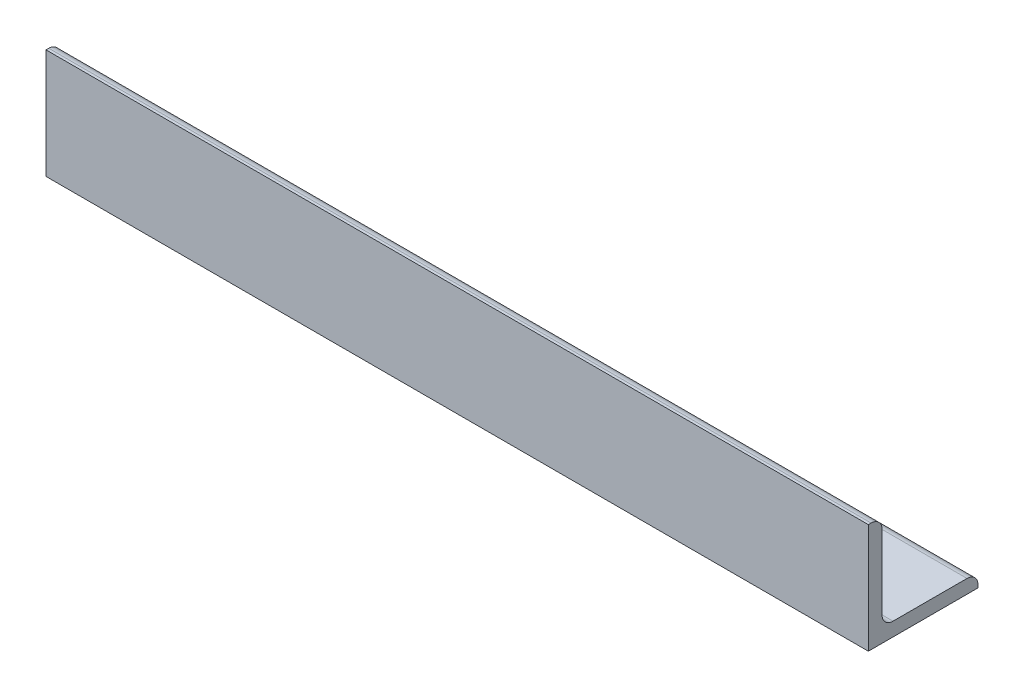
ISO-10303-21;
HEADER;
FILE_DESCRIPTION(('STEP AP214'),'2;1');
FILE_NAME('part.step','',(''),(''),'','','');
FILE_SCHEMA(('AUTOMOTIVE_DESIGN { 1 0 10303 214 1 1 1 1 }'));
ENDSEC;
DATA;
#1=APPLICATION_CONTEXT('core data for automotive mechanical design processes');
#2=APPLICATION_PROTOCOL_DEFINITION('international standard','automotive_design',2000,#1);
#3=PRODUCT_CONTEXT('',#1,'mechanical');
#4=PRODUCT('Part','Part','',(#3));
#5=PRODUCT_RELATED_PRODUCT_CATEGORY('part','',(#4));
#6=PRODUCT_DEFINITION_FORMATION('','',#4);
#7=PRODUCT_DEFINITION_CONTEXT('part definition',#1,'design');
#8=PRODUCT_DEFINITION('design','',#6,#7);
#9=PRODUCT_DEFINITION_SHAPE('','',#8);
#10=(LENGTH_UNIT() NAMED_UNIT(*) SI_UNIT(.MILLI.,.METRE.));
#11=(NAMED_UNIT(*) PLANE_ANGLE_UNIT() SI_UNIT($,.RADIAN.));
#12=(NAMED_UNIT(*) SI_UNIT($,.STERADIAN.) SOLID_ANGLE_UNIT());
#13=UNCERTAINTY_MEASURE_WITH_UNIT(LENGTH_MEASURE(1.E-05),#10,'distance_accuracy_value','');
#14=(GEOMETRIC_REPRESENTATION_CONTEXT(3) GLOBAL_UNCERTAINTY_ASSIGNED_CONTEXT((#13)) GLOBAL_UNIT_ASSIGNED_CONTEXT((#10,
#11,#12)) REPRESENTATION_CONTEXT('',''));
#15=CARTESIAN_POINT('',(0.,0.,0.));
#16=DIRECTION('',(0.,0.,1.));
#17=DIRECTION('',(1.,0.,0.));
#18=AXIS2_PLACEMENT_3D('',#15,#16,#17);
#19=CARTESIAN_POINT('',(190.5,0.,-25.4));
#20=DIRECTION('',(0.,1.,0.));
#21=DIRECTION('',(0.,0.,1.));
#22=AXIS2_PLACEMENT_3D('',#19,#20,#21);
#23=PLANE('',#22);
#24=DIRECTION('',(0.,0.,-1.));
#25=VECTOR('',#24,1.);
#26=CARTESIAN_POINT('',(0.,0.,-25.4));
#27=LINE('',#26,#25);
#28=CARTESIAN_POINT('',(0.,0.,0.));
#29=VERTEX_POINT('',#28);
#30=CARTESIAN_POINT('',(0.,0.,-25.4));
#31=VERTEX_POINT('',#30);
#32=EDGE_CURVE('E164',#29,#31,#27,.T.);
#33=ORIENTED_EDGE('',*,*,#32,.T.);
#34=DIRECTION('',(-1.,0.,0.));
#35=VECTOR('',#34,1.);
#36=CARTESIAN_POINT('',(190.5,0.,-25.4));
#37=LINE('',#36,#35);
#38=CARTESIAN_POINT('',(190.5,0.,-25.4));
#39=VERTEX_POINT('',#38);
#40=EDGE_CURVE('E11',#39,#31,#37,.T.);
#41=ORIENTED_EDGE('',*,*,#40,.F.);
#42=DIRECTION('',(0.,0.,-1.));
#43=VECTOR('',#42,1.);
#44=CARTESIAN_POINT('',(190.5,0.,-25.4));
#45=LINE('',#44,#43);
#46=CARTESIAN_POINT('',(190.5,0.,0.));
#47=VERTEX_POINT('',#46);
#48=EDGE_CURVE('E184',#47,#39,#45,.T.);
#49=ORIENTED_EDGE('',*,*,#48,.F.);
#50=DIRECTION('',(-1.,0.,0.));
#51=VECTOR('',#50,1.);
#52=CARTESIAN_POINT('',(190.5,0.,0.));
#53=LINE('',#52,#51);
#54=EDGE_CURVE('E160',#47,#29,#53,.T.);
#55=ORIENTED_EDGE('',*,*,#54,.T.);
#56=EDGE_LOOP('',(#33,#41,#49,#55));
#57=FACE_BOUND('',#56,.T.);
#58=ADVANCED_FACE('F45',(#57),#23,.F.);
#59=CARTESIAN_POINT('',(190.5,0.634999999999983,-25.4));
#60=DIRECTION('',(0.,0.,1.));
#61=DIRECTION('',(1.,0.,0.));
#62=AXIS2_PLACEMENT_3D('',#59,#60,#61);
#63=PLANE('',#62);
#64=DIRECTION('',(0.,1.,0.));
#65=VECTOR('',#64,1.);
#66=CARTESIAN_POINT('',(0.,0.634999999999983,-25.4));
#67=LINE('',#66,#65);
#68=CARTESIAN_POINT('',(0.,0.634999999999983,-25.4));
#69=VERTEX_POINT('',#68);
#70=EDGE_CURVE('E168',#31,#69,#67,.T.);
#71=ORIENTED_EDGE('',*,*,#70,.T.);
#72=DIRECTION('',(-1.,0.,0.));
#73=VECTOR('',#72,1.);
#74=CARTESIAN_POINT('',(190.5,0.634999999999983,-25.4));
#75=LINE('',#74,#73);
#76=CARTESIAN_POINT('',(190.5,0.634999999999983,-25.4));
#77=VERTEX_POINT('',#76);
#78=EDGE_CURVE('E54',#77,#69,#75,.T.);
#79=ORIENTED_EDGE('',*,*,#78,.F.);
#80=DIRECTION('',(0.,1.,0.));
#81=VECTOR('',#80,1.);
#82=CARTESIAN_POINT('',(190.5,0.634999999999983,-25.4));
#83=LINE('',#82,#81);
#84=EDGE_CURVE('E115',#39,#77,#83,.T.);
#85=ORIENTED_EDGE('',*,*,#84,.F.);
#86=ORIENTED_EDGE('',*,*,#40,.T.);
#87=EDGE_LOOP('',(#71,#79,#85,#86));
#88=FACE_BOUND('',#87,.T.);
#89=ADVANCED_FACE('F240',(#88),#63,.F.);
#90=CARTESIAN_POINT('',(190.5,0.635000000000001,-22.86));
#91=DIRECTION('',(-1.,0.,0.));
#92=DIRECTION('',(0.,0.,1.));
#93=AXIS2_PLACEMENT_3D('',#90,#91,#92);
#94=CYLINDRICAL_SURFACE('',#93,2.54);
#95=CARTESIAN_POINT('',(0.,0.635000000000001,-22.86));
#96=DIRECTION('',(1.,0.,0.));
#97=DIRECTION('',(0.,0.,1.));
#98=AXIS2_PLACEMENT_3D('',#95,#96,#97);
#99=CIRCLE('',#98,2.54);
#100=CARTESIAN_POINT('',(0.,3.175,-22.86));
#101=VERTEX_POINT('',#100);
#102=EDGE_CURVE('E171',#69,#101,#99,.T.);
#103=ORIENTED_EDGE('',*,*,#102,.T.);
#104=DIRECTION('',(-1.,0.,0.));
#105=VECTOR('',#104,1.);
#106=CARTESIAN_POINT('',(190.5,3.175,-22.86));
#107=LINE('',#106,#105);
#108=CARTESIAN_POINT('',(190.5,3.175,-22.86));
#109=VERTEX_POINT('',#108);
#110=EDGE_CURVE('E199',#109,#101,#107,.T.);
#111=ORIENTED_EDGE('',*,*,#110,.F.);
#112=CARTESIAN_POINT('',(190.5,0.635000000000001,-22.86));
#113=DIRECTION('',(1.,0.,0.));
#114=DIRECTION('',(0.,0.,1.));
#115=AXIS2_PLACEMENT_3D('',#112,#113,#114);
#116=CIRCLE('',#115,2.54);
#117=EDGE_CURVE('E209',#77,#109,#116,.T.);
#118=ORIENTED_EDGE('',*,*,#117,.F.);
#119=ORIENTED_EDGE('',*,*,#78,.T.);
#120=EDGE_LOOP('',(#103,#111,#118,#119));
#121=FACE_BOUND('',#120,.T.);
#122=ADVANCED_FACE('F207',(#121),#94,.T.);
#123=CARTESIAN_POINT('',(190.5,3.175,-5.71500000000002));
#124=DIRECTION('',(0.,-1.,0.));
#125=DIRECTION('',(0.,0.,-1.));
#126=AXIS2_PLACEMENT_3D('',#123,#124,#125);
#127=PLANE('',#126);
#128=DIRECTION('',(0.,0.,1.));
#129=VECTOR('',#128,1.);
#130=CARTESIAN_POINT('',(0.,3.175,-5.71500000000002));
#131=LINE('',#130,#129);
#132=CARTESIAN_POINT('',(0.,3.175,-5.71500000000002));
#133=VERTEX_POINT('',#132);
#134=EDGE_CURVE('E174',#101,#133,#131,.T.);
#135=ORIENTED_EDGE('',*,*,#134,.T.);
#136=DIRECTION('',(-1.,0.,0.));
#137=VECTOR('',#136,1.);
#138=CARTESIAN_POINT('',(190.5,3.175,-5.71500000000002));
#139=LINE('',#138,#137);
#140=CARTESIAN_POINT('',(190.5,3.175,-5.71500000000002));
#141=VERTEX_POINT('',#140);
#142=EDGE_CURVE('E195',#141,#133,#139,.T.);
#143=ORIENTED_EDGE('',*,*,#142,.F.);
#144=DIRECTION('',(0.,0.,1.));
#145=VECTOR('',#144,1.);
#146=CARTESIAN_POINT('',(190.5,3.175,-5.71500000000002));
#147=LINE('',#146,#145);
#148=EDGE_CURVE('E226',#109,#141,#147,.T.);
#149=ORIENTED_EDGE('',*,*,#148,.F.);
#150=ORIENTED_EDGE('',*,*,#110,.T.);
#151=EDGE_LOOP('',(#135,#143,#149,#150));
#152=FACE_BOUND('',#151,.T.);
#153=ADVANCED_FACE('F218',(#152),#127,.F.);
#154=CARTESIAN_POINT('',(190.5,5.715,-5.715));
#155=DIRECTION('',(-1.,0.,0.));
#156=DIRECTION('',(0.,0.,1.));
#157=AXIS2_PLACEMENT_3D('',#154,#155,#156);
#158=CYLINDRICAL_SURFACE('',#157,2.54);
#159=CARTESIAN_POINT('',(0.,5.715,-5.715));
#160=DIRECTION('',(-1.,0.,0.));
#161=DIRECTION('',(0.,0.,-1.));
#162=AXIS2_PLACEMENT_3D('',#159,#160,#161);
#163=CIRCLE('',#162,2.54);
#164=CARTESIAN_POINT('',(0.,5.71500000000002,-3.175));
#165=VERTEX_POINT('',#164);
#166=EDGE_CURVE('E177',#133,#165,#163,.T.);
#167=ORIENTED_EDGE('',*,*,#166,.T.);
#168=DIRECTION('',(-1.,0.,0.));
#169=VECTOR('',#168,1.);
#170=CARTESIAN_POINT('',(190.5,5.71500000000002,-3.175));
#171=LINE('',#170,#169);
#172=CARTESIAN_POINT('',(190.5,5.71500000000002,-3.175));
#173=VERTEX_POINT('',#172);
#174=EDGE_CURVE('E191',#173,#165,#171,.T.);
#175=ORIENTED_EDGE('',*,*,#174,.F.);
#176=CARTESIAN_POINT('',(190.5,5.715,-5.715));
#177=DIRECTION('',(-1.,0.,0.));
#178=DIRECTION('',(0.,0.,-1.));
#179=AXIS2_PLACEMENT_3D('',#176,#177,#178);
#180=CIRCLE('',#179,2.54);
#181=EDGE_CURVE('E224',#141,#173,#180,.T.);
#182=ORIENTED_EDGE('',*,*,#181,.F.);
#183=ORIENTED_EDGE('',*,*,#142,.T.);
#184=EDGE_LOOP('',(#167,#175,#182,#183));
#185=FACE_BOUND('',#184,.T.);
#186=ADVANCED_FACE('F222',(#185),#158,.F.);
#187=CARTESIAN_POINT('',(190.5,22.86,-3.175));
#188=DIRECTION('',(0.,0.,1.));
#189=DIRECTION('',(0.,-1.,0.));
#190=AXIS2_PLACEMENT_3D('',#187,#188,#189);
#191=PLANE('',#190);
#192=DIRECTION('',(0.,1.,0.));
#193=VECTOR('',#192,1.);
#194=CARTESIAN_POINT('',(0.,22.86,-3.175));
#195=LINE('',#194,#193);
#196=CARTESIAN_POINT('',(0.,22.86,-3.175));
#197=VERTEX_POINT('',#196);
#198=EDGE_CURVE('E179',#165,#197,#195,.T.);
#199=ORIENTED_EDGE('',*,*,#198,.T.);
#200=DIRECTION('',(-1.,0.,0.));
#201=VECTOR('',#200,1.);
#202=CARTESIAN_POINT('',(190.5,22.86,-3.175));
#203=LINE('',#202,#201);
#204=CARTESIAN_POINT('',(190.5,22.86,-3.175));
#205=VERTEX_POINT('',#204);
#206=EDGE_CURVE('E153',#205,#197,#203,.T.);
#207=ORIENTED_EDGE('',*,*,#206,.F.);
#208=DIRECTION('',(0.,1.,0.));
#209=VECTOR('',#208,1.);
#210=CARTESIAN_POINT('',(190.5,22.86,-3.175));
#211=LINE('',#210,#209);
#212=EDGE_CURVE('E142',#173,#205,#211,.T.);
#213=ORIENTED_EDGE('',*,*,#212,.F.);
#214=ORIENTED_EDGE('',*,*,#174,.T.);
#215=EDGE_LOOP('',(#199,#207,#213,#214));
#216=FACE_BOUND('',#215,.T.);
#217=ADVANCED_FACE('F252',(#216),#191,.F.);
#218=CARTESIAN_POINT('',(190.5,22.86,-0.635));
#219=DIRECTION('',(-1.,0.,0.));
#220=DIRECTION('',(0.,0.,1.));
#221=AXIS2_PLACEMENT_3D('',#218,#219,#220);
#222=CYLINDRICAL_SURFACE('',#221,2.54);
#223=CARTESIAN_POINT('',(0.,22.86,-0.635));
#224=DIRECTION('',(1.,0.,0.));
#225=DIRECTION('',(0.,0.,1.));
#226=AXIS2_PLACEMENT_3D('',#223,#224,#225);
#227=CIRCLE('',#226,2.54);
#228=CARTESIAN_POINT('',(0.,25.4,-0.634999999999982));
#229=VERTEX_POINT('',#228);
#230=EDGE_CURVE('E151',#197,#229,#227,.T.);
#231=ORIENTED_EDGE('',*,*,#230,.T.);
#232=DIRECTION('',(-1.,0.,0.));
#233=VECTOR('',#232,1.);
#234=CARTESIAN_POINT('',(190.5,25.4,-0.634999999999982));
#235=LINE('',#234,#233);
#236=CARTESIAN_POINT('',(190.5,25.4,-0.634999999999982));
#237=VERTEX_POINT('',#236);
#238=EDGE_CURVE('E148',#237,#229,#235,.T.);
#239=ORIENTED_EDGE('',*,*,#238,.F.);
#240=CARTESIAN_POINT('',(190.5,22.86,-0.635));
#241=DIRECTION('',(1.,0.,0.));
#242=DIRECTION('',(0.,0.,1.));
#243=AXIS2_PLACEMENT_3D('',#240,#241,#242);
#244=CIRCLE('',#243,2.54);
#245=EDGE_CURVE('E136',#205,#237,#244,.T.);
#246=ORIENTED_EDGE('',*,*,#245,.F.);
#247=ORIENTED_EDGE('',*,*,#206,.T.);
#248=EDGE_LOOP('',(#231,#239,#246,#247));
#249=FACE_BOUND('',#248,.T.);
#250=ADVANCED_FACE('F149',(#249),#222,.T.);
#251=CARTESIAN_POINT('',(190.5,25.4,0.));
#252=DIRECTION('',(0.,-1.,0.));
#253=DIRECTION('',(0.,0.,-1.));
#254=AXIS2_PLACEMENT_3D('',#251,#252,#253);
#255=PLANE('',#254);
#256=DIRECTION('',(0.,0.,1.));
#257=VECTOR('',#256,1.);
#258=CARTESIAN_POINT('',(0.,25.4,0.));
#259=LINE('',#258,#257);
#260=CARTESIAN_POINT('',(0.,25.4,0.));
#261=VERTEX_POINT('',#260);
#262=EDGE_CURVE('E99',#229,#261,#259,.T.);
#263=ORIENTED_EDGE('',*,*,#262,.T.);
#264=DIRECTION('',(-1.,0.,0.));
#265=VECTOR('',#264,1.);
#266=CARTESIAN_POINT('',(190.5,25.4,0.));
#267=LINE('',#266,#265);
#268=CARTESIAN_POINT('',(190.5,25.4,0.));
#269=VERTEX_POINT('',#268);
#270=EDGE_CURVE('E154',#269,#261,#267,.T.);
#271=ORIENTED_EDGE('',*,*,#270,.F.);
#272=DIRECTION('',(0.,0.,1.));
#273=VECTOR('',#272,1.);
#274=CARTESIAN_POINT('',(190.5,25.4,0.));
#275=LINE('',#274,#273);
#276=EDGE_CURVE('E140',#237,#269,#275,.T.);
#277=ORIENTED_EDGE('',*,*,#276,.F.);
#278=ORIENTED_EDGE('',*,*,#238,.T.);
#279=EDGE_LOOP('',(#263,#271,#277,#278));
#280=FACE_BOUND('',#279,.T.);
#281=ADVANCED_FACE('F156',(#280),#255,.F.);
#282=CARTESIAN_POINT('',(190.5,0.,0.));
#283=DIRECTION('',(0.,0.,-1.));
#284=DIRECTION('',(-1.,0.,0.));
#285=AXIS2_PLACEMENT_3D('',#282,#283,#284);
#286=PLANE('',#285);
#287=DIRECTION('',(0.,-1.,0.));
#288=VECTOR('',#287,1.);
#289=CARTESIAN_POINT('',(0.,0.,0.));
#290=LINE('',#289,#288);
#291=EDGE_CURVE('E105',#261,#29,#290,.T.);
#292=ORIENTED_EDGE('',*,*,#291,.T.);
#293=ORIENTED_EDGE('',*,*,#54,.F.);
#294=DIRECTION('',(0.,-1.,0.));
#295=VECTOR('',#294,1.);
#296=CARTESIAN_POINT('',(190.5,0.,0.));
#297=LINE('',#296,#295);
#298=EDGE_CURVE('E65',#269,#47,#297,.T.);
#299=ORIENTED_EDGE('',*,*,#298,.F.);
#300=ORIENTED_EDGE('',*,*,#270,.T.);
#301=EDGE_LOOP('',(#292,#293,#299,#300));
#302=FACE_BOUND('',#301,.T.);
#303=ADVANCED_FACE('F260',(#302),#286,.F.);
#304=CARTESIAN_POINT('',(190.5,22.86,-0.635));
#305=DIRECTION('',(-1.,0.,0.));
#306=DIRECTION('',(0.,0.,1.));
#307=AXIS2_PLACEMENT_3D('',#304,#305,#306);
#308=PLANE('',#307);
#309=ORIENTED_EDGE('',*,*,#48,.T.);
#310=ORIENTED_EDGE('',*,*,#84,.T.);
#311=ORIENTED_EDGE('',*,*,#117,.T.);
#312=ORIENTED_EDGE('',*,*,#148,.T.);
#313=ORIENTED_EDGE('',*,*,#181,.T.);
#314=ORIENTED_EDGE('',*,*,#212,.T.);
#315=ORIENTED_EDGE('',*,*,#245,.T.);
#316=ORIENTED_EDGE('',*,*,#276,.T.);
#317=ORIENTED_EDGE('',*,*,#298,.T.);
#318=EDGE_LOOP('',(#309,#310,#311,#312,#313,#314,#315,#316,#317));
#319=FACE_BOUND('',#318,.T.);
#320=ADVANCED_FACE('F138',(#319),#308,.F.);
#321=CARTESIAN_POINT('',(0.,22.86,-0.635));
#322=DIRECTION('',(-1.,0.,0.));
#323=DIRECTION('',(0.,0.,1.));
#324=AXIS2_PLACEMENT_3D('',#321,#322,#323);
#325=PLANE('',#324);
#326=ORIENTED_EDGE('',*,*,#32,.F.);
#327=ORIENTED_EDGE('',*,*,#291,.F.);
#328=ORIENTED_EDGE('',*,*,#262,.F.);
#329=ORIENTED_EDGE('',*,*,#230,.F.);
#330=ORIENTED_EDGE('',*,*,#198,.F.);
#331=ORIENTED_EDGE('',*,*,#166,.F.);
#332=ORIENTED_EDGE('',*,*,#134,.F.);
#333=ORIENTED_EDGE('',*,*,#102,.F.);
#334=ORIENTED_EDGE('',*,*,#70,.F.);
#335=EDGE_LOOP('',(#326,#327,#328,#329,#330,#331,#332,#333,#334));
#336=FACE_BOUND('',#335,.T.);
#337=ADVANCED_FACE('F213',(#336),#325,.T.);
#338=CLOSED_SHELL('',(#58,#89,#122,#153,#186,#217,#250,#281,#303,#320,#337));
#339=MANIFOLD_SOLID_BREP('B2',#338);
#340=ADVANCED_BREP_SHAPE_REPRESENTATION('',(#18,#339),#14);
#341=SHAPE_DEFINITION_REPRESENTATION(#9,#340);
ENDSEC;
END-ISO-10303-21;
